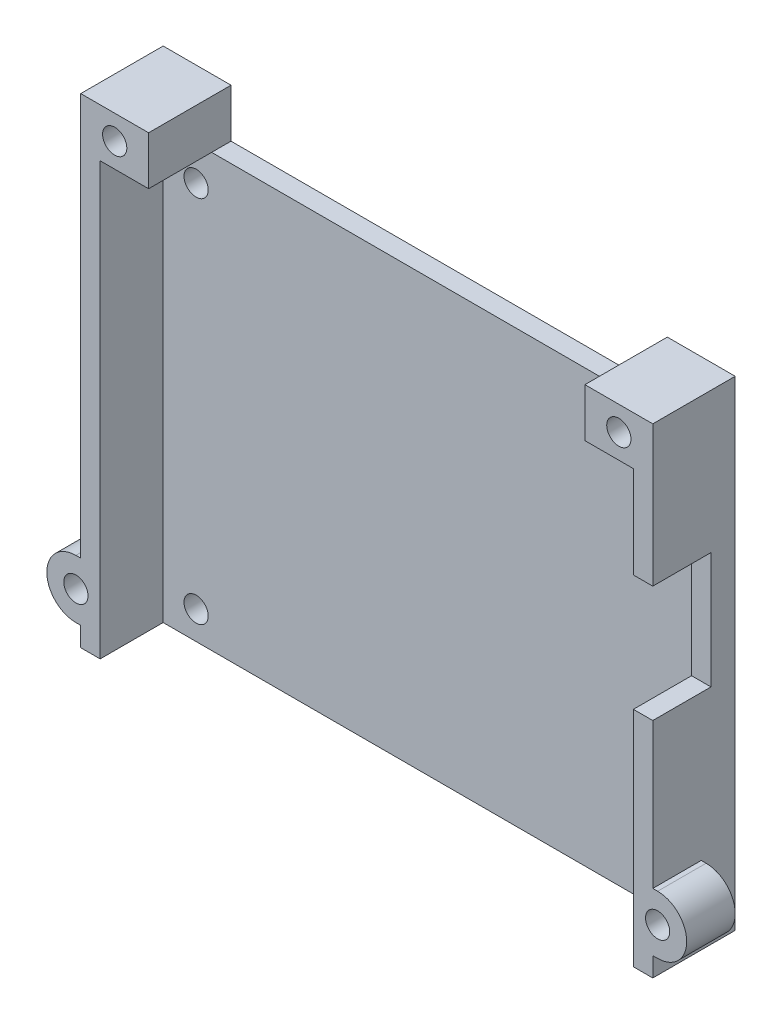
ISO-10303-21;
HEADER;
FILE_DESCRIPTION(('STEP AP214'),'2;1');
FILE_NAME('part.step','',(''),(''),'','','');
FILE_SCHEMA(('AUTOMOTIVE_DESIGN { 1 0 10303 214 1 1 1 1 }'));
ENDSEC;
DATA;
#1=APPLICATION_CONTEXT('core data for automotive mechanical design processes');
#2=APPLICATION_PROTOCOL_DEFINITION('international standard','automotive_design',2000,#1);
#3=PRODUCT_CONTEXT('',#1,'mechanical');
#4=PRODUCT('Part','Part','',(#3));
#5=PRODUCT_RELATED_PRODUCT_CATEGORY('part','',(#4));
#6=PRODUCT_DEFINITION_FORMATION('','',#4);
#7=PRODUCT_DEFINITION_CONTEXT('part definition',#1,'design');
#8=PRODUCT_DEFINITION('design','',#6,#7);
#9=PRODUCT_DEFINITION_SHAPE('','',#8);
#10=(LENGTH_UNIT() NAMED_UNIT(*) SI_UNIT(.MILLI.,.METRE.));
#11=(NAMED_UNIT(*) PLANE_ANGLE_UNIT() SI_UNIT($,.RADIAN.));
#12=(NAMED_UNIT(*) SI_UNIT($,.STERADIAN.) SOLID_ANGLE_UNIT());
#13=UNCERTAINTY_MEASURE_WITH_UNIT(LENGTH_MEASURE(1.E-05),#10,'distance_accuracy_value','');
#14=(GEOMETRIC_REPRESENTATION_CONTEXT(3) GLOBAL_UNCERTAINTY_ASSIGNED_CONTEXT((#13)) GLOBAL_UNIT_ASSIGNED_CONTEXT((#10,
#11,#12)) REPRESENTATION_CONTEXT('',''));
#15=CARTESIAN_POINT('',(0.,0.,0.));
#16=DIRECTION('',(0.,0.,1.));
#17=DIRECTION('',(1.,0.,0.));
#18=AXIS2_PLACEMENT_3D('',#15,#16,#17);
#19=CARTESIAN_POINT('',(59.5,5.,0.));
#20=DIRECTION('',(0.,0.,-1.));
#21=DIRECTION('',(-1.,0.,0.));
#22=AXIS2_PLACEMENT_3D('',#19,#20,#21);
#23=CYLINDRICAL_SURFACE('',#22,1.25000000000001);
#24=CARTESIAN_POINT('',(59.5,5.,0.));
#25=DIRECTION('',(0.,0.,-1.));
#26=DIRECTION('',(-1.,0.,0.));
#27=AXIS2_PLACEMENT_3D('',#24,#25,#26);
#28=CIRCLE('',#27,1.25000000000001);
#29=CARTESIAN_POINT('',(58.25,5.,0.));
#30=VERTEX_POINT('',#29);
#31=EDGE_CURVE('E424',#30,#30,#28,.T.);
#32=ORIENTED_EDGE('',*,*,#31,.F.);
#33=EDGE_LOOP('',(#32));
#34=FACE_BOUND('',#33,.T.);
#35=CARTESIAN_POINT('',(59.5,5.,-5.5));
#36=DIRECTION('',(0.,0.,-1.));
#37=DIRECTION('',(-1.,0.,0.));
#38=AXIS2_PLACEMENT_3D('',#35,#36,#37);
#39=CIRCLE('',#38,1.25000000000001);
#40=CARTESIAN_POINT('',(59.,3.85435607626104,-5.5));
#41=VERTEX_POINT('',#40);
#42=CARTESIAN_POINT('',(59.,6.14564392373897,-5.5));
#43=VERTEX_POINT('',#42);
#44=EDGE_CURVE('E251',#41,#43,#39,.T.);
#45=ORIENTED_EDGE('',*,*,#44,.T.);
#46=DIRECTION('',(0.,0.,-1.));
#47=VECTOR('',#46,1.);
#48=CARTESIAN_POINT('',(59.,6.14564392373897,-5.));
#49=LINE('',#48,#47);
#50=CARTESIAN_POINT('',(59.,6.14564392373897,-5.));
#51=VERTEX_POINT('',#50);
#52=EDGE_CURVE('E247',#51,#43,#49,.T.);
#53=ORIENTED_EDGE('',*,*,#52,.F.);
#54=CARTESIAN_POINT('',(59.5,5.,-5.));
#55=DIRECTION('',(0.,0.,-1.));
#56=DIRECTION('',(-1.,0.,0.));
#57=AXIS2_PLACEMENT_3D('',#54,#55,#56);
#58=CIRCLE('',#57,1.25000000000001);
#59=CARTESIAN_POINT('',(59.,3.85435607626104,-5.));
#60=VERTEX_POINT('',#59);
#61=EDGE_CURVE('E258',#51,#60,#58,.T.);
#62=ORIENTED_EDGE('',*,*,#61,.T.);
#63=DIRECTION('',(0.,0.,-1.));
#64=VECTOR('',#63,1.);
#65=CARTESIAN_POINT('',(59.,3.85435607626104,-5.));
#66=LINE('',#65,#64);
#67=EDGE_CURVE('E244',#60,#41,#66,.T.);
#68=ORIENTED_EDGE('',*,*,#67,.T.);
#69=EDGE_LOOP('',(#45,#53,#62,#68));
#70=FACE_BOUND('',#69,.T.);
#71=ADVANCED_FACE('F45',(#34,#70),#23,.F.);
#72=CARTESIAN_POINT('',(-0.5,5.,0.));
#73=DIRECTION('',(0.,0.,-1.));
#74=DIRECTION('',(-1.,0.,0.));
#75=AXIS2_PLACEMENT_3D('',#72,#73,#74);
#76=CYLINDRICAL_SURFACE('',#75,1.25);
#77=CARTESIAN_POINT('',(-0.5,5.,0.));
#78=DIRECTION('',(0.,0.,-1.));
#79=DIRECTION('',(-1.,0.,0.));
#80=AXIS2_PLACEMENT_3D('',#77,#78,#79);
#81=CIRCLE('',#80,1.25);
#82=CARTESIAN_POINT('',(-1.75,5.,0.));
#83=VERTEX_POINT('',#82);
#84=EDGE_CURVE('E405',#83,#83,#81,.T.);
#85=ORIENTED_EDGE('',*,*,#84,.F.);
#86=EDGE_LOOP('',(#85));
#87=FACE_BOUND('',#86,.T.);
#88=CARTESIAN_POINT('',(-0.5,5.,-5.5));
#89=DIRECTION('',(0.,0.,-1.));
#90=DIRECTION('',(-1.,0.,0.));
#91=AXIS2_PLACEMENT_3D('',#88,#89,#90);
#92=CIRCLE('',#91,1.25);
#93=CARTESIAN_POINT('',(0.,6.14564392373896,-5.5));
#94=VERTEX_POINT('',#93);
#95=CARTESIAN_POINT('',(0.,3.85435607626104,-5.5));
#96=VERTEX_POINT('',#95);
#97=EDGE_CURVE('E277',#94,#96,#92,.T.);
#98=ORIENTED_EDGE('',*,*,#97,.T.);
#99=DIRECTION('',(0.,0.,-1.));
#100=VECTOR('',#99,1.);
#101=CARTESIAN_POINT('',(0.,3.85435607626104,-5.));
#102=LINE('',#101,#100);
#103=CARTESIAN_POINT('',(0.,3.85435607626104,-5.));
#104=VERTEX_POINT('',#103);
#105=EDGE_CURVE('E296',#104,#96,#102,.T.);
#106=ORIENTED_EDGE('',*,*,#105,.F.);
#107=CARTESIAN_POINT('',(-0.5,5.,-5.));
#108=DIRECTION('',(0.,0.,-1.));
#109=DIRECTION('',(-1.,0.,0.));
#110=AXIS2_PLACEMENT_3D('',#107,#108,#109);
#111=CIRCLE('',#110,1.25);
#112=CARTESIAN_POINT('',(0.,6.14564392373896,-5.));
#113=VERTEX_POINT('',#112);
#114=EDGE_CURVE('E273',#104,#113,#111,.T.);
#115=ORIENTED_EDGE('',*,*,#114,.T.);
#116=DIRECTION('',(0.,0.,-1.));
#117=VECTOR('',#116,1.);
#118=CARTESIAN_POINT('',(0.,6.14564392373896,-5.));
#119=LINE('',#118,#117);
#120=EDGE_CURVE('E292',#113,#94,#119,.T.);
#121=ORIENTED_EDGE('',*,*,#120,.T.);
#122=EDGE_LOOP('',(#98,#106,#115,#121));
#123=FACE_BOUND('',#122,.T.);
#124=ADVANCED_FACE('F669',(#87,#123),#76,.F.);
#125=CARTESIAN_POINT('',(0.,44.5,-8.5));
#126=DIRECTION('',(0.,0.,1.));
#127=DIRECTION('',(1.,0.,0.));
#128=AXIS2_PLACEMENT_3D('',#125,#126,#127);
#129=PLANE('',#128);
#130=CARTESIAN_POINT('',(53.6,2.9,-8.5));
#131=DIRECTION('',(0.,0.,-1.));
#132=DIRECTION('',(-1.,0.,0.));
#133=AXIS2_PLACEMENT_3D('',#130,#131,#132);
#134=CIRCLE('',#133,1.25);
#135=CARTESIAN_POINT('',(52.35,2.9,-8.5));
#136=VERTEX_POINT('',#135);
#137=EDGE_CURVE('E260',#136,#136,#134,.T.);
#138=ORIENTED_EDGE('',*,*,#137,.F.);
#139=EDGE_LOOP('',(#138));
#140=FACE_BOUND('',#139,.T.);
#141=CARTESIAN_POINT('',(5.4,2.90000000000001,-8.5));
#142=DIRECTION('',(0.,0.,-1.));
#143=DIRECTION('',(-1.,0.,0.));
#144=AXIS2_PLACEMENT_3D('',#141,#142,#143);
#145=CIRCLE('',#144,1.25);
#146=CARTESIAN_POINT('',(4.15,2.90000000000001,-8.5));
#147=VERTEX_POINT('',#146);
#148=EDGE_CURVE('E265',#147,#147,#145,.T.);
#149=ORIENTED_EDGE('',*,*,#148,.F.);
#150=EDGE_LOOP('',(#149));
#151=FACE_BOUND('',#150,.T.);
#152=CARTESIAN_POINT('',(5.4,40.95,-8.5));
#153=DIRECTION('',(0.,0.,-1.));
#154=DIRECTION('',(-1.,0.,0.));
#155=AXIS2_PLACEMENT_3D('',#152,#153,#154);
#156=CIRCLE('',#155,1.25);
#157=CARTESIAN_POINT('',(4.15,40.95,-8.5));
#158=VERTEX_POINT('',#157);
#159=EDGE_CURVE('E300',#158,#158,#156,.T.);
#160=ORIENTED_EDGE('',*,*,#159,.F.);
#161=EDGE_LOOP('',(#160));
#162=FACE_BOUND('',#161,.T.);
#163=CARTESIAN_POINT('',(53.6,40.95,-8.5));
#164=DIRECTION('',(0.,0.,-1.));
#165=DIRECTION('',(-1.,0.,0.));
#166=AXIS2_PLACEMENT_3D('',#163,#164,#165);
#167=CIRCLE('',#166,1.25);
#168=CARTESIAN_POINT('',(52.35,40.95,-8.5));
#169=VERTEX_POINT('',#168);
#170=EDGE_CURVE('E304',#169,#169,#167,.T.);
#171=ORIENTED_EDGE('',*,*,#170,.F.);
#172=EDGE_LOOP('',(#171));
#173=FACE_BOUND('',#172,.T.);
#174=CARTESIAN_POINT('',(55.5,47.,-8.5));
#175=DIRECTION('',(0.,0.,-1.));
#176=DIRECTION('',(-1.,0.,0.));
#177=AXIS2_PLACEMENT_3D('',#174,#175,#176);
#178=CIRCLE('',#177,1.25);
#179=CARTESIAN_POINT('',(54.25,47.,-8.5));
#180=VERTEX_POINT('',#179);
#181=EDGE_CURVE('E333',#180,#180,#178,.T.);
#182=ORIENTED_EDGE('',*,*,#181,.F.);
#183=EDGE_LOOP('',(#182));
#184=FACE_BOUND('',#183,.T.);
#185=CARTESIAN_POINT('',(3.5,47.,-8.5));
#186=DIRECTION('',(0.,0.,-1.));
#187=DIRECTION('',(-1.,0.,0.));
#188=AXIS2_PLACEMENT_3D('',#185,#186,#187);
#189=CIRCLE('',#188,1.25);
#190=CARTESIAN_POINT('',(2.25,47.,-8.5));
#191=VERTEX_POINT('',#190);
#192=EDGE_CURVE('E337',#191,#191,#189,.T.);
#193=ORIENTED_EDGE('',*,*,#192,.F.);
#194=EDGE_LOOP('',(#193));
#195=FACE_BOUND('',#194,.T.);
#196=DIRECTION('',(0.,-1.,0.));
#197=VECTOR('',#196,1.);
#198=CARTESIAN_POINT('',(59.,44.5,-8.5));
#199=LINE('',#198,#197);
#200=CARTESIAN_POINT('',(59.,49.5,-8.5));
#201=VERTEX_POINT('',#200);
#202=CARTESIAN_POINT('',(59.,0.,-8.5));
#203=VERTEX_POINT('',#202);
#204=EDGE_CURVE('E550',#201,#203,#199,.T.);
#205=ORIENTED_EDGE('',*,*,#204,.T.);
#206=DIRECTION('',(-1.,0.,0.));
#207=VECTOR('',#206,1.);
#208=CARTESIAN_POINT('',(0.,0.,-8.5));
#209=LINE('',#208,#207);
#210=CARTESIAN_POINT('',(0.,0.,-8.5));
#211=VERTEX_POINT('',#210);
#212=EDGE_CURVE('E508',#203,#211,#209,.T.);
#213=ORIENTED_EDGE('',*,*,#212,.T.);
#214=DIRECTION('',(0.,-1.,0.));
#215=VECTOR('',#214,1.);
#216=CARTESIAN_POINT('',(0.,44.5,-8.5));
#217=LINE('',#216,#215);
#218=CARTESIAN_POINT('',(0.,49.5,-8.5));
#219=VERTEX_POINT('',#218);
#220=EDGE_CURVE('E520',#219,#211,#217,.T.);
#221=ORIENTED_EDGE('',*,*,#220,.F.);
#222=DIRECTION('',(-1.,0.,0.));
#223=VECTOR('',#222,1.);
#224=CARTESIAN_POINT('',(0.,49.5,-8.5));
#225=LINE('',#224,#223);
#226=CARTESIAN_POINT('',(7.,49.5,-8.5));
#227=VERTEX_POINT('',#226);
#228=EDGE_CURVE('E389',#227,#219,#225,.T.);
#229=ORIENTED_EDGE('',*,*,#228,.F.);
#230=DIRECTION('',(0.,-1.,0.));
#231=VECTOR('',#230,1.);
#232=CARTESIAN_POINT('',(7.,49.5,-8.5));
#233=LINE('',#232,#231);
#234=CARTESIAN_POINT('',(7.,44.5,-8.5));
#235=VERTEX_POINT('',#234);
#236=EDGE_CURVE('E393',#227,#235,#233,.T.);
#237=ORIENTED_EDGE('',*,*,#236,.T.);
#238=DIRECTION('',(-1.,0.,0.));
#239=VECTOR('',#238,1.);
#240=CARTESIAN_POINT('',(0.,44.5,-8.5));
#241=LINE('',#240,#239);
#242=CARTESIAN_POINT('',(52.,44.5,-8.5));
#243=VERTEX_POINT('',#242);
#244=EDGE_CURVE('E517',#243,#235,#241,.T.);
#245=ORIENTED_EDGE('',*,*,#244,.F.);
#246=DIRECTION('',(0.,-1.,0.));
#247=VECTOR('',#246,1.);
#248=CARTESIAN_POINT('',(52.,49.5,-8.5));
#249=LINE('',#248,#247);
#250=CARTESIAN_POINT('',(52.,49.5,-8.5));
#251=VERTEX_POINT('',#250);
#252=EDGE_CURVE('E332',#251,#243,#249,.T.);
#253=ORIENTED_EDGE('',*,*,#252,.F.);
#254=DIRECTION('',(-1.,0.,0.));
#255=VECTOR('',#254,1.);
#256=CARTESIAN_POINT('',(59.,49.5,-8.5));
#257=LINE('',#256,#255);
#258=EDGE_CURVE('E369',#201,#251,#257,.T.);
#259=ORIENTED_EDGE('',*,*,#258,.F.);
#260=EDGE_LOOP('',(#205,#213,#221,#229,#237,#245,#253,#259));
#261=FACE_BOUND('',#260,.T.);
#262=ADVANCED_FACE('F622',(#140,#151,#162,#173,#184,#195,#261),#129,.F.);
#263=CARTESIAN_POINT('',(0.,2.00000000000005,0.));
#264=DIRECTION('',(0.,1.,0.));
#265=DIRECTION('',(-1.,0.,0.));
#266=AXIS2_PLACEMENT_3D('',#263,#264,#265);
#267=PLANE('',#266);
#268=DIRECTION('',(1.,0.,0.));
#269=VECTOR('',#268,1.);
#270=CARTESIAN_POINT('',(0.,2.00000000000005,-5.));
#271=LINE('',#270,#269);
#272=CARTESIAN_POINT('',(59.,2.,-5.));
#273=VERTEX_POINT('',#272);
#274=CARTESIAN_POINT('',(59.5,2.,-5.));
#275=VERTEX_POINT('',#274);
#276=EDGE_CURVE('E270',#273,#275,#271,.T.);
#277=ORIENTED_EDGE('',*,*,#276,.T.);
#278=DIRECTION('',(0.,0.,-1.));
#279=VECTOR('',#278,1.);
#280=CARTESIAN_POINT('',(59.5,2.,0.));
#281=LINE('',#280,#279);
#282=CARTESIAN_POINT('',(59.5,2.,0.));
#283=VERTEX_POINT('',#282);
#284=EDGE_CURVE('E456',#283,#275,#281,.T.);
#285=ORIENTED_EDGE('',*,*,#284,.F.);
#286=DIRECTION('',(1.,0.,0.));
#287=VECTOR('',#286,1.);
#288=CARTESIAN_POINT('',(0.,2.00000000000005,0.));
#289=LINE('',#288,#287);
#290=CARTESIAN_POINT('',(59.,2.,0.));
#291=VERTEX_POINT('',#290);
#292=EDGE_CURVE('E447',#291,#283,#289,.T.);
#293=ORIENTED_EDGE('',*,*,#292,.F.);
#294=DIRECTION('',(0.,0.,-1.));
#295=VECTOR('',#294,1.);
#296=CARTESIAN_POINT('',(59.,2.,0.));
#297=LINE('',#296,#295);
#298=EDGE_CURVE('E451',#291,#273,#297,.T.);
#299=ORIENTED_EDGE('',*,*,#298,.T.);
#300=EDGE_LOOP('',(#277,#285,#293,#299));
#301=FACE_BOUND('',#300,.T.);
#302=ADVANCED_FACE('F701',(#301),#267,.F.);
#303=CARTESIAN_POINT('',(59.5,5.,0.));
#304=DIRECTION('',(0.,0.,-1.));
#305=DIRECTION('',(-1.,0.,0.));
#306=AXIS2_PLACEMENT_3D('',#303,#304,#305);
#307=CYLINDRICAL_SURFACE('',#306,3.);
#308=ORIENTED_EDGE('',*,*,#284,.T.);
#309=CARTESIAN_POINT('',(59.5,5.,-5.));
#310=DIRECTION('',(0.,0.,-1.));
#311=DIRECTION('',(-1.,0.,0.));
#312=AXIS2_PLACEMENT_3D('',#309,#310,#311);
#313=CIRCLE('',#312,3.);
#314=CARTESIAN_POINT('',(59.5,8.,-5.));
#315=VERTEX_POINT('',#314);
#316=EDGE_CURVE('E1161',#315,#275,#313,.T.);
#317=ORIENTED_EDGE('',*,*,#316,.F.);
#318=DIRECTION('',(0.,0.,-1.));
#319=VECTOR('',#318,1.);
#320=CARTESIAN_POINT('',(59.5,8.,0.));
#321=LINE('',#320,#319);
#322=CARTESIAN_POINT('',(59.5,8.,0.));
#323=VERTEX_POINT('',#322);
#324=EDGE_CURVE('E460',#323,#315,#321,.T.);
#325=ORIENTED_EDGE('',*,*,#324,.F.);
#326=CARTESIAN_POINT('',(59.5,5.,0.));
#327=DIRECTION('',(0.,0.,-1.));
#328=DIRECTION('',(-1.,0.,0.));
#329=AXIS2_PLACEMENT_3D('',#326,#327,#328);
#330=CIRCLE('',#329,3.);
#331=EDGE_CURVE('E443',#323,#283,#330,.T.);
#332=ORIENTED_EDGE('',*,*,#331,.T.);
#333=EDGE_LOOP('',(#308,#317,#325,#332));
#334=FACE_BOUND('',#333,.T.);
#335=ADVANCED_FACE('F981',(#334),#307,.T.);
#336=CARTESIAN_POINT('',(0.,8.0000000000002,0.));
#337=DIRECTION('',(0.,1.,0.));
#338=DIRECTION('',(-1.,0.,0.));
#339=AXIS2_PLACEMENT_3D('',#336,#337,#338);
#340=PLANE('',#339);
#341=ORIENTED_EDGE('',*,*,#324,.T.);
#342=DIRECTION('',(1.,0.,0.));
#343=VECTOR('',#342,1.);
#344=CARTESIAN_POINT('',(0.,8.0000000000002,-5.));
#345=LINE('',#344,#343);
#346=CARTESIAN_POINT('',(59.,8.,-5.));
#347=VERTEX_POINT('',#346);
#348=EDGE_CURVE('E1165',#347,#315,#345,.T.);
#349=ORIENTED_EDGE('',*,*,#348,.F.);
#350=DIRECTION('',(0.,0.,-1.));
#351=VECTOR('',#350,1.);
#352=CARTESIAN_POINT('',(59.,8.,0.));
#353=LINE('',#352,#351);
#354=CARTESIAN_POINT('',(59.,8.,0.));
#355=VERTEX_POINT('',#354);
#356=EDGE_CURVE('E450',#355,#347,#353,.T.);
#357=ORIENTED_EDGE('',*,*,#356,.F.);
#358=DIRECTION('',(1.,0.,0.));
#359=VECTOR('',#358,1.);
#360=CARTESIAN_POINT('',(0.,8.0000000000002,0.));
#361=LINE('',#360,#359);
#362=EDGE_CURVE('E439',#355,#323,#361,.T.);
#363=ORIENTED_EDGE('',*,*,#362,.T.);
#364=EDGE_LOOP('',(#341,#349,#357,#363));
#365=FACE_BOUND('',#364,.T.);
#366=ADVANCED_FACE('F680',(#365),#340,.T.);
#367=CARTESIAN_POINT('',(0.,8.,0.));
#368=DIRECTION('',(0.,-1.,0.));
#369=DIRECTION('',(0.,0.,-1.));
#370=AXIS2_PLACEMENT_3D('',#367,#368,#369);
#371=PLANE('',#370);
#372=DIRECTION('',(-1.,0.,0.));
#373=VECTOR('',#372,1.);
#374=CARTESIAN_POINT('',(0.,8.,-5.));
#375=LINE('',#374,#373);
#376=CARTESIAN_POINT('',(0.,8.,-5.));
#377=VERTEX_POINT('',#376);
#378=CARTESIAN_POINT('',(-0.5,8.,-5.));
#379=VERTEX_POINT('',#378);
#380=EDGE_CURVE('E288',#377,#379,#375,.T.);
#381=ORIENTED_EDGE('',*,*,#380,.T.);
#382=DIRECTION('',(0.,0.,-1.));
#383=VECTOR('',#382,1.);
#384=CARTESIAN_POINT('',(-0.5,8.,0.));
#385=LINE('',#384,#383);
#386=CARTESIAN_POINT('',(-0.5,8.,0.));
#387=VERTEX_POINT('',#386);
#388=EDGE_CURVE('E425',#387,#379,#385,.T.);
#389=ORIENTED_EDGE('',*,*,#388,.F.);
#390=DIRECTION('',(-1.,0.,0.));
#391=VECTOR('',#390,1.);
#392=CARTESIAN_POINT('',(0.,8.,0.));
#393=LINE('',#392,#391);
#394=CARTESIAN_POINT('',(0.,8.,0.));
#395=VERTEX_POINT('',#394);
#396=EDGE_CURVE('E416',#395,#387,#393,.T.);
#397=ORIENTED_EDGE('',*,*,#396,.F.);
#398=DIRECTION('',(0.,0.,-1.));
#399=VECTOR('',#398,1.);
#400=CARTESIAN_POINT('',(0.,8.,0.));
#401=LINE('',#400,#399);
#402=EDGE_CURVE('E420',#395,#377,#401,.T.);
#403=ORIENTED_EDGE('',*,*,#402,.T.);
#404=EDGE_LOOP('',(#381,#389,#397,#403));
#405=FACE_BOUND('',#404,.T.);
#406=ADVANCED_FACE('F593',(#405),#371,.F.);
#407=CARTESIAN_POINT('',(-0.5,5.,0.));
#408=DIRECTION('',(0.,0.,-1.));
#409=DIRECTION('',(-1.,0.,0.));
#410=AXIS2_PLACEMENT_3D('',#407,#408,#409);
#411=CYLINDRICAL_SURFACE('',#410,3.);
#412=CARTESIAN_POINT('',(-0.5,5.,-5.));
#413=DIRECTION('',(0.,0.,-1.));
#414=DIRECTION('',(-1.,0.,0.));
#415=AXIS2_PLACEMENT_3D('',#412,#413,#414);
#416=CIRCLE('',#415,3.);
#417=CARTESIAN_POINT('',(-0.5,2.,-5.));
#418=VERTEX_POINT('',#417);
#419=EDGE_CURVE('E284',#379,#418,#416,.F.);
#420=ORIENTED_EDGE('',*,*,#419,.T.);
#421=DIRECTION('',(0.,0.,-1.));
#422=VECTOR('',#421,1.);
#423=CARTESIAN_POINT('',(-0.5,2.,0.));
#424=LINE('',#423,#422);
#425=CARTESIAN_POINT('',(-0.5,2.,0.));
#426=VERTEX_POINT('',#425);
#427=EDGE_CURVE('E429',#426,#418,#424,.T.);
#428=ORIENTED_EDGE('',*,*,#427,.F.);
#429=CARTESIAN_POINT('',(-0.5,5.,0.));
#430=DIRECTION('',(0.,0.,-1.));
#431=DIRECTION('',(-1.,0.,0.));
#432=AXIS2_PLACEMENT_3D('',#429,#430,#431);
#433=CIRCLE('',#432,3.);
#434=EDGE_CURVE('E413',#387,#426,#433,.F.);
#435=ORIENTED_EDGE('',*,*,#434,.F.);
#436=ORIENTED_EDGE('',*,*,#388,.T.);
#437=EDGE_LOOP('',(#420,#428,#435,#436));
#438=FACE_BOUND('',#437,.T.);
#439=ADVANCED_FACE('F598',(#438),#411,.T.);
#440=CARTESIAN_POINT('',(0.,2.,0.));
#441=DIRECTION('',(0.,-1.,0.));
#442=DIRECTION('',(0.,0.,-1.));
#443=AXIS2_PLACEMENT_3D('',#440,#441,#442);
#444=PLANE('',#443);
#445=ORIENTED_EDGE('',*,*,#427,.T.);
#446=DIRECTION('',(-1.,0.,0.));
#447=VECTOR('',#446,1.);
#448=CARTESIAN_POINT('',(0.,2.,-5.));
#449=LINE('',#448,#447);
#450=CARTESIAN_POINT('',(0.,2.,-5.));
#451=VERTEX_POINT('',#450);
#452=EDGE_CURVE('E280',#451,#418,#449,.T.);
#453=ORIENTED_EDGE('',*,*,#452,.F.);
#454=DIRECTION('',(0.,0.,-1.));
#455=VECTOR('',#454,1.);
#456=CARTESIAN_POINT('',(0.,2.,0.));
#457=LINE('',#456,#455);
#458=CARTESIAN_POINT('',(0.,2.,0.));
#459=VERTEX_POINT('',#458);
#460=EDGE_CURVE('E419',#459,#451,#457,.T.);
#461=ORIENTED_EDGE('',*,*,#460,.F.);
#462=DIRECTION('',(-1.,0.,0.));
#463=VECTOR('',#462,1.);
#464=CARTESIAN_POINT('',(0.,2.,0.));
#465=LINE('',#464,#463);
#466=EDGE_CURVE('E409',#459,#426,#465,.T.);
#467=ORIENTED_EDGE('',*,*,#466,.T.);
#468=EDGE_LOOP('',(#445,#453,#461,#467));
#469=FACE_BOUND('',#468,.T.);
#470=ADVANCED_FACE('F601',(#469),#444,.T.);
#471=CARTESIAN_POINT('',(0.,44.5,0.));
#472=DIRECTION('',(0.,-1.,0.));
#473=DIRECTION('',(0.,0.,-1.));
#474=AXIS2_PLACEMENT_3D('',#471,#472,#473);
#475=PLANE('',#474);
#476=DIRECTION('',(0.,0.,1.));
#477=VECTOR('',#476,1.);
#478=CARTESIAN_POINT('',(52.,44.5,0.));
#479=LINE('',#478,#477);
#480=CARTESIAN_POINT('',(52.,44.5,-6.5));
#481=VERTEX_POINT('',#480);
#482=EDGE_CURVE('E358',#243,#481,#479,.T.);
#483=ORIENTED_EDGE('',*,*,#482,.F.);
#484=ORIENTED_EDGE('',*,*,#244,.T.);
#485=DIRECTION('',(0.,0.,-1.));
#486=VECTOR('',#485,1.);
#487=CARTESIAN_POINT('',(7.,44.5,0.));
#488=LINE('',#487,#486);
#489=CARTESIAN_POINT('',(7.,44.5,-6.5));
#490=VERTEX_POINT('',#489);
#491=EDGE_CURVE('E11',#490,#235,#488,.T.);
#492=ORIENTED_EDGE('',*,*,#491,.F.);
#493=DIRECTION('',(1.,0.,0.));
#494=VECTOR('',#493,1.);
#495=CARTESIAN_POINT('',(2.,44.5,-6.5));
#496=LINE('',#495,#494);
#497=EDGE_CURVE('E507',#490,#481,#496,.T.);
#498=ORIENTED_EDGE('',*,*,#497,.T.);
#499=EDGE_LOOP('',(#483,#484,#492,#498));
#500=FACE_BOUND('',#499,.T.);
#501=ADVANCED_FACE('F694',(#500),#475,.F.);
#502=CARTESIAN_POINT('',(57.,44.5,0.));
#503=DIRECTION('',(0.,0.,-1.));
#504=DIRECTION('',(-1.,0.,0.));
#505=AXIS2_PLACEMENT_3D('',#502,#503,#504);
#506=PLANE('',#505);
#507=CARTESIAN_POINT('',(55.5,47.,0.));
#508=DIRECTION('',(0.,0.,-1.));
#509=DIRECTION('',(-1.,0.,0.));
#510=AXIS2_PLACEMENT_3D('',#507,#508,#509);
#511=CIRCLE('',#510,1.25);
#512=CARTESIAN_POINT('',(54.25,47.,0.));
#513=VERTEX_POINT('',#512);
#514=EDGE_CURVE('E328',#513,#513,#511,.T.);
#515=ORIENTED_EDGE('',*,*,#514,.T.);
#516=EDGE_LOOP('',(#515));
#517=FACE_BOUND('',#516,.T.);
#518=DIRECTION('',(0.,-1.,0.));
#519=VECTOR('',#518,1.);
#520=CARTESIAN_POINT('',(57.,44.5,0.));
#521=LINE('',#520,#519);
#522=CARTESIAN_POINT('',(57.,44.5,0.));
#523=VERTEX_POINT('',#522);
#524=CARTESIAN_POINT('',(57.,35.,0.));
#525=VERTEX_POINT('',#524);
#526=EDGE_CURVE('E560',#523,#525,#521,.T.);
#527=ORIENTED_EDGE('',*,*,#526,.T.);
#528=DIRECTION('',(1.,0.,0.));
#529=VECTOR('',#528,1.);
#530=CARTESIAN_POINT('',(49.,35.,0.));
#531=LINE('',#530,#529);
#532=CARTESIAN_POINT('',(59.,35.,0.));
#533=VERTEX_POINT('',#532);
#534=EDGE_CURVE('E478',#525,#533,#531,.T.);
#535=ORIENTED_EDGE('',*,*,#534,.T.);
#536=DIRECTION('',(0.,-1.,0.));
#537=VECTOR('',#536,1.);
#538=CARTESIAN_POINT('',(59.,44.5,0.));
#539=LINE('',#538,#537);
#540=CARTESIAN_POINT('',(59.,49.5,0.));
#541=VERTEX_POINT('',#540);
#542=EDGE_CURVE('E554',#541,#533,#539,.T.);
#543=ORIENTED_EDGE('',*,*,#542,.F.);
#544=DIRECTION('',(1.,0.,0.));
#545=VECTOR('',#544,1.);
#546=CARTESIAN_POINT('',(59.,49.5,0.));
#547=LINE('',#546,#545);
#548=CARTESIAN_POINT('',(52.,49.5,0.));
#549=VERTEX_POINT('',#548);
#550=EDGE_CURVE('E351',#549,#541,#547,.T.);
#551=ORIENTED_EDGE('',*,*,#550,.F.);
#552=DIRECTION('',(0.,-1.,0.));
#553=VECTOR('',#552,1.);
#554=CARTESIAN_POINT('',(52.,49.5,0.));
#555=LINE('',#554,#553);
#556=CARTESIAN_POINT('',(52.,44.5,0.));
#557=VERTEX_POINT('',#556);
#558=EDGE_CURVE('E347',#549,#557,#555,.T.);
#559=ORIENTED_EDGE('',*,*,#558,.T.);
#560=DIRECTION('',(1.,0.,0.));
#561=VECTOR('',#560,1.);
#562=CARTESIAN_POINT('',(59.,44.5,0.));
#563=LINE('',#562,#561);
#564=EDGE_CURVE('E352',#557,#523,#563,.T.);
#565=ORIENTED_EDGE('',*,*,#564,.T.);
#566=EDGE_LOOP('',(#527,#535,#543,#551,#559,#565));
#567=FACE_BOUND('',#566,.T.);
#568=ADVANCED_FACE('F656',(#517,#567),#506,.F.);
#569=CARTESIAN_POINT('',(0.,44.5,0.));
#570=DIRECTION('',(1.,0.,0.));
#571=DIRECTION('',(0.,0.,-1.));
#572=AXIS2_PLACEMENT_3D('',#569,#570,#571);
#573=PLANE('',#572);
#574=DIRECTION('',(0.,-1.,0.));
#575=VECTOR('',#574,1.);
#576=CARTESIAN_POINT('',(0.,44.5,0.));
#577=LINE('',#576,#575);
#578=CARTESIAN_POINT('',(0.,0.,0.));
#579=VERTEX_POINT('',#578);
#580=EDGE_CURVE('E574',#459,#579,#577,.T.);
#581=ORIENTED_EDGE('',*,*,#580,.F.);
#582=ORIENTED_EDGE('',*,*,#460,.T.);
#583=DIRECTION('',(0.,1.,0.));
#584=VECTOR('',#583,1.);
#585=CARTESIAN_POINT('',(0.,0.,-5.));
#586=LINE('',#585,#584);
#587=EDGE_CURVE('E71',#451,#104,#586,.T.);
#588=ORIENTED_EDGE('',*,*,#587,.T.);
#589=ORIENTED_EDGE('',*,*,#105,.T.);
#590=DIRECTION('',(0.,1.,0.));
#591=VECTOR('',#590,1.);
#592=CARTESIAN_POINT('',(0.,0.,-5.5));
#593=LINE('',#592,#591);
#594=EDGE_CURVE('E256',#96,#94,#593,.T.);
#595=ORIENTED_EDGE('',*,*,#594,.T.);
#596=ORIENTED_EDGE('',*,*,#120,.F.);
#597=EDGE_CURVE('E281',#113,#377,#586,.T.);
#598=ORIENTED_EDGE('',*,*,#597,.T.);
#599=ORIENTED_EDGE('',*,*,#402,.F.);
#600=CARTESIAN_POINT('',(0.,49.5,0.));
#601=VERTEX_POINT('',#600);
#602=EDGE_CURVE('E49',#601,#395,#577,.T.);
#603=ORIENTED_EDGE('',*,*,#602,.F.);
#604=DIRECTION('',(0.,0.,1.));
#605=VECTOR('',#604,1.);
#606=CARTESIAN_POINT('',(0.,49.5,0.));
#607=LINE('',#606,#605);
#608=EDGE_CURVE('E379',#219,#601,#607,.T.);
#609=ORIENTED_EDGE('',*,*,#608,.F.);
#610=ORIENTED_EDGE('',*,*,#220,.T.);
#611=DIRECTION('',(0.,0.,1.));
#612=VECTOR('',#611,1.);
#613=CARTESIAN_POINT('',(0.,0.,0.));
#614=LINE('',#613,#612);
#615=EDGE_CURVE('E502',#211,#579,#614,.T.);
#616=ORIENTED_EDGE('',*,*,#615,.T.);
#617=EDGE_LOOP('',(#581,#582,#588,#589,#595,#596,#598,#599,#603,#609,#610,#616));
#618=FACE_BOUND('',#617,.T.);
#619=ADVANCED_FACE('F47',(#618),#573,.F.);
#620=CARTESIAN_POINT('',(0.,44.5,0.));
#621=DIRECTION('',(0.,0.,-1.));
#622=DIRECTION('',(-1.,0.,0.));
#623=AXIS2_PLACEMENT_3D('',#620,#621,#622);
#624=PLANE('',#623);
#625=CARTESIAN_POINT('',(3.5,47.,0.));
#626=DIRECTION('',(0.,0.,-1.));
#627=DIRECTION('',(-1.,0.,0.));
#628=AXIS2_PLACEMENT_3D('',#625,#626,#627);
#629=CIRCLE('',#628,1.25);
#630=CARTESIAN_POINT('',(2.25,47.,0.));
#631=VERTEX_POINT('',#630);
#632=EDGE_CURVE('E327',#631,#631,#629,.T.);
#633=ORIENTED_EDGE('',*,*,#632,.T.);
#634=EDGE_LOOP('',(#633));
#635=FACE_BOUND('',#634,.T.);
#636=ORIENTED_EDGE('',*,*,#602,.T.);
#637=ORIENTED_EDGE('',*,*,#396,.T.);
#638=ORIENTED_EDGE('',*,*,#434,.T.);
#639=ORIENTED_EDGE('',*,*,#466,.F.);
#640=ORIENTED_EDGE('',*,*,#580,.T.);
#641=DIRECTION('',(1.,0.,0.));
#642=VECTOR('',#641,1.);
#643=CARTESIAN_POINT('',(0.,0.,0.));
#644=LINE('',#643,#642);
#645=CARTESIAN_POINT('',(2.,0.,0.));
#646=VERTEX_POINT('',#645);
#647=EDGE_CURVE('E524',#579,#646,#644,.T.);
#648=ORIENTED_EDGE('',*,*,#647,.T.);
#649=DIRECTION('',(0.,-1.,0.));
#650=VECTOR('',#649,1.);
#651=CARTESIAN_POINT('',(2.,44.5,0.));
#652=LINE('',#651,#650);
#653=CARTESIAN_POINT('',(2.,44.5,0.));
#654=VERTEX_POINT('',#653);
#655=EDGE_CURVE('E571',#654,#646,#652,.T.);
#656=ORIENTED_EDGE('',*,*,#655,.F.);
#657=DIRECTION('',(1.,0.,0.));
#658=VECTOR('',#657,1.);
#659=CARTESIAN_POINT('',(0.,44.5,0.));
#660=LINE('',#659,#658);
#661=CARTESIAN_POINT('',(7.,44.5,0.));
#662=VERTEX_POINT('',#661);
#663=EDGE_CURVE('E378',#654,#662,#660,.T.);
#664=ORIENTED_EDGE('',*,*,#663,.T.);
#665=DIRECTION('',(0.,-1.,0.));
#666=VECTOR('',#665,1.);
#667=CARTESIAN_POINT('',(7.,49.5,0.));
#668=LINE('',#667,#666);
#669=CARTESIAN_POINT('',(7.,49.5,0.));
#670=VERTEX_POINT('',#669);
#671=EDGE_CURVE('E401',#670,#662,#668,.T.);
#672=ORIENTED_EDGE('',*,*,#671,.F.);
#673=DIRECTION('',(1.,0.,0.));
#674=VECTOR('',#673,1.);
#675=CARTESIAN_POINT('',(0.,49.5,0.));
#676=LINE('',#675,#674);
#677=EDGE_CURVE('E383',#601,#670,#676,.T.);
#678=ORIENTED_EDGE('',*,*,#677,.F.);
#679=EDGE_LOOP('',(#636,#637,#638,#639,#640,#648,#656,#664,#672,#678));
#680=FACE_BOUND('',#679,.T.);
#681=ORIENTED_EDGE('',*,*,#84,.T.);
#682=EDGE_LOOP('',(#681));
#683=FACE_BOUND('',#682,.T.);
#684=ADVANCED_FACE('F586',(#635,#680,#683),#624,.F.);
#685=CARTESIAN_POINT('',(2.,44.5,0.));
#686=DIRECTION('',(-1.,0.,0.));
#687=DIRECTION('',(0.,0.,1.));
#688=AXIS2_PLACEMENT_3D('',#685,#686,#687);
#689=PLANE('',#688);
#690=DIRECTION('',(0.,0.,-1.));
#691=VECTOR('',#690,1.);
#692=CARTESIAN_POINT('',(2.,0.,0.));
#693=LINE('',#692,#691);
#694=CARTESIAN_POINT('',(2.,0.,-6.5));
#695=VERTEX_POINT('',#694);
#696=EDGE_CURVE('E527',#646,#695,#693,.T.);
#697=ORIENTED_EDGE('',*,*,#696,.T.);
#698=DIRECTION('',(0.,-1.,0.));
#699=VECTOR('',#698,1.);
#700=CARTESIAN_POINT('',(2.,44.5,-6.5));
#701=LINE('',#700,#699);
#702=CARTESIAN_POINT('',(2.,44.5,-6.5));
#703=VERTEX_POINT('',#702);
#704=EDGE_CURVE('E568',#703,#695,#701,.T.);
#705=ORIENTED_EDGE('',*,*,#704,.F.);
#706=DIRECTION('',(0.,0.,-1.));
#707=VECTOR('',#706,1.);
#708=CARTESIAN_POINT('',(2.,44.5,0.));
#709=LINE('',#708,#707);
#710=EDGE_CURVE('E503',#654,#703,#709,.T.);
#711=ORIENTED_EDGE('',*,*,#710,.F.);
#712=ORIENTED_EDGE('',*,*,#655,.T.);
#713=EDGE_LOOP('',(#697,#705,#711,#712));
#714=FACE_BOUND('',#713,.T.);
#715=ADVANCED_FACE('F609',(#714),#689,.F.);
#716=CARTESIAN_POINT('',(2.,44.5,-6.5));
#717=DIRECTION('',(0.,0.,-1.));
#718=DIRECTION('',(-1.,0.,0.));
#719=AXIS2_PLACEMENT_3D('',#716,#717,#718);
#720=PLANE('',#719);
#721=CARTESIAN_POINT('',(53.6,2.9,-6.5));
#722=DIRECTION('',(0.,0.,-1.));
#723=DIRECTION('',(-1.,0.,0.));
#724=AXIS2_PLACEMENT_3D('',#721,#722,#723);
#725=CIRCLE('',#724,1.25);
#726=CARTESIAN_POINT('',(52.35,2.9,-6.5));
#727=VERTEX_POINT('',#726);
#728=EDGE_CURVE('E323',#727,#727,#725,.T.);
#729=ORIENTED_EDGE('',*,*,#728,.T.);
#730=EDGE_LOOP('',(#729));
#731=FACE_BOUND('',#730,.T.);
#732=CARTESIAN_POINT('',(5.4,2.90000000000001,-6.5));
#733=DIRECTION('',(0.,0.,-1.));
#734=DIRECTION('',(-1.,0.,0.));
#735=AXIS2_PLACEMENT_3D('',#732,#733,#734);
#736=CIRCLE('',#735,1.25);
#737=CARTESIAN_POINT('',(4.15,2.90000000000001,-6.5));
#738=VERTEX_POINT('',#737);
#739=EDGE_CURVE('E319',#738,#738,#736,.T.);
#740=ORIENTED_EDGE('',*,*,#739,.T.);
#741=EDGE_LOOP('',(#740));
#742=FACE_BOUND('',#741,.T.);
#743=CARTESIAN_POINT('',(5.4,40.95,-6.5));
#744=DIRECTION('',(0.,0.,-1.));
#745=DIRECTION('',(-1.,0.,0.));
#746=AXIS2_PLACEMENT_3D('',#743,#744,#745);
#747=CIRCLE('',#746,1.25);
#748=CARTESIAN_POINT('',(4.15,40.95,-6.5));
#749=VERTEX_POINT('',#748);
#750=EDGE_CURVE('E315',#749,#749,#747,.T.);
#751=ORIENTED_EDGE('',*,*,#750,.T.);
#752=EDGE_LOOP('',(#751));
#753=FACE_BOUND('',#752,.T.);
#754=CARTESIAN_POINT('',(53.6,40.95,-6.5));
#755=DIRECTION('',(0.,0.,-1.));
#756=DIRECTION('',(-1.,0.,0.));
#757=AXIS2_PLACEMENT_3D('',#754,#755,#756);
#758=CIRCLE('',#757,1.25);
#759=CARTESIAN_POINT('',(52.35,40.95,-6.5));
#760=VERTEX_POINT('',#759);
#761=EDGE_CURVE('E311',#760,#760,#758,.T.);
#762=ORIENTED_EDGE('',*,*,#761,.T.);
#763=EDGE_LOOP('',(#762));
#764=FACE_BOUND('',#763,.T.);
#765=DIRECTION('',(1.,0.,0.));
#766=VECTOR('',#765,1.);
#767=CARTESIAN_POINT('',(2.,0.,-6.5));
#768=LINE('',#767,#766);
#769=CARTESIAN_POINT('',(57.,0.,-6.5));
#770=VERTEX_POINT('',#769);
#771=EDGE_CURVE('E530',#695,#770,#768,.T.);
#772=ORIENTED_EDGE('',*,*,#771,.T.);
#773=DIRECTION('',(0.,-1.,0.));
#774=VECTOR('',#773,1.);
#775=CARTESIAN_POINT('',(57.,44.5,-6.5));
#776=LINE('',#775,#774);
#777=CARTESIAN_POINT('',(57.,44.5,-6.5));
#778=VERTEX_POINT('',#777);
#779=EDGE_CURVE('E564',#778,#770,#776,.T.);
#780=ORIENTED_EDGE('',*,*,#779,.F.);
#781=DIRECTION('',(1.,0.,0.));
#782=VECTOR('',#781,1.);
#783=CARTESIAN_POINT('',(2.,44.5,-6.5));
#784=LINE('',#783,#782);
#785=EDGE_CURVE('E362',#481,#778,#784,.T.);
#786=ORIENTED_EDGE('',*,*,#785,.F.);
#787=ORIENTED_EDGE('',*,*,#497,.F.);
#788=EDGE_CURVE('E509',#703,#490,#496,.T.);
#789=ORIENTED_EDGE('',*,*,#788,.F.);
#790=ORIENTED_EDGE('',*,*,#704,.T.);
#791=EDGE_LOOP('',(#772,#780,#786,#787,#789,#790));
#792=FACE_BOUND('',#791,.T.);
#793=ADVANCED_FACE('F640',(#731,#742,#753,#764,#792),#720,.F.);
#794=CARTESIAN_POINT('',(57.,44.5,-6.5));
#795=DIRECTION('',(1.,0.,0.));
#796=DIRECTION('',(0.,0.,-1.));
#797=AXIS2_PLACEMENT_3D('',#794,#795,#796);
#798=PLANE('',#797);
#799=DIRECTION('',(0.,1.,0.));
#800=VECTOR('',#799,1.);
#801=CARTESIAN_POINT('',(57.,44.5,-6.));
#802=LINE('',#801,#800);
#803=CARTESIAN_POINT('',(57.,23.,-6.));
#804=VERTEX_POINT('',#803);
#805=CARTESIAN_POINT('',(57.,35.,-6.));
#806=VERTEX_POINT('',#805);
#807=EDGE_CURVE('E494',#804,#806,#802,.T.);
#808=ORIENTED_EDGE('',*,*,#807,.T.);
#809=DIRECTION('',(0.,0.,1.));
#810=VECTOR('',#809,1.);
#811=CARTESIAN_POINT('',(57.,35.,-6.5));
#812=LINE('',#811,#810);
#813=EDGE_CURVE('E498',#806,#525,#812,.T.);
#814=ORIENTED_EDGE('',*,*,#813,.T.);
#815=ORIENTED_EDGE('',*,*,#526,.F.);
#816=DIRECTION('',(0.,0.,1.));
#817=VECTOR('',#816,1.);
#818=CARTESIAN_POINT('',(57.,44.5,-6.5));
#819=LINE('',#818,#817);
#820=EDGE_CURVE('E513',#778,#523,#819,.T.);
#821=ORIENTED_EDGE('',*,*,#820,.F.);
#822=ORIENTED_EDGE('',*,*,#779,.T.);
#823=DIRECTION('',(0.,0.,1.));
#824=VECTOR('',#823,1.);
#825=CARTESIAN_POINT('',(57.,0.,-6.5));
#826=LINE('',#825,#824);
#827=CARTESIAN_POINT('',(57.,0.,0.));
#828=VERTEX_POINT('',#827);
#829=EDGE_CURVE('E533',#770,#828,#826,.T.);
#830=ORIENTED_EDGE('',*,*,#829,.T.);
#831=CARTESIAN_POINT('',(57.,23.,0.));
#832=VERTEX_POINT('',#831);
#833=EDGE_CURVE('E558',#832,#828,#521,.T.);
#834=ORIENTED_EDGE('',*,*,#833,.F.);
#835=DIRECTION('',(0.,0.,-1.));
#836=VECTOR('',#835,1.);
#837=CARTESIAN_POINT('',(57.,23.,-6.5));
#838=LINE('',#837,#836);
#839=EDGE_CURVE('E482',#832,#804,#838,.T.);
#840=ORIENTED_EDGE('',*,*,#839,.T.);
#841=EDGE_LOOP('',(#808,#814,#815,#821,#822,#830,#834,#840));
#842=FACE_BOUND('',#841,.T.);
#843=ADVANCED_FACE('F637',(#842),#798,.F.);
#844=ORIENTED_EDGE('',*,*,#31,.T.);
#845=EDGE_LOOP('',(#844));
#846=FACE_BOUND('',#845,.T.);
#847=CARTESIAN_POINT('',(59.,23.,0.));
#848=VERTEX_POINT('',#847);
#849=EDGE_CURVE('E559',#848,#355,#539,.T.);
#850=ORIENTED_EDGE('',*,*,#849,.F.);
#851=DIRECTION('',(1.,0.,0.));
#852=VECTOR('',#851,1.);
#853=CARTESIAN_POINT('',(49.,23.,0.));
#854=LINE('',#853,#852);
#855=EDGE_CURVE('E477',#832,#848,#854,.T.);
#856=ORIENTED_EDGE('',*,*,#855,.F.);
#857=ORIENTED_EDGE('',*,*,#833,.T.);
#858=DIRECTION('',(1.,0.,0.));
#859=VECTOR('',#858,1.);
#860=CARTESIAN_POINT('',(57.,0.,0.));
#861=LINE('',#860,#859);
#862=CARTESIAN_POINT('',(59.,0.,0.));
#863=VERTEX_POINT('',#862);
#864=EDGE_CURVE('E537',#828,#863,#861,.T.);
#865=ORIENTED_EDGE('',*,*,#864,.T.);
#866=EDGE_CURVE('E553',#291,#863,#539,.T.);
#867=ORIENTED_EDGE('',*,*,#866,.F.);
#868=ORIENTED_EDGE('',*,*,#292,.T.);
#869=ORIENTED_EDGE('',*,*,#331,.F.);
#870=ORIENTED_EDGE('',*,*,#362,.F.);
#871=EDGE_LOOP('',(#850,#856,#857,#865,#867,#868,#869,#870));
#872=FACE_BOUND('',#871,.T.);
#873=ADVANCED_FACE('F632',(#846,#872),#506,.F.);
#874=CARTESIAN_POINT('',(59.,44.5,0.));
#875=DIRECTION('',(-1.,0.,0.));
#876=DIRECTION('',(0.,0.,1.));
#877=AXIS2_PLACEMENT_3D('',#874,#875,#876);
#878=PLANE('',#877);
#879=ORIENTED_EDGE('',*,*,#849,.T.);
#880=ORIENTED_EDGE('',*,*,#356,.T.);
#881=DIRECTION('',(0.,-1.,0.));
#882=VECTOR('',#881,1.);
#883=CARTESIAN_POINT('',(59.,0.,-5.));
#884=LINE('',#883,#882);
#885=EDGE_CURVE('E63',#347,#51,#884,.T.);
#886=ORIENTED_EDGE('',*,*,#885,.T.);
#887=ORIENTED_EDGE('',*,*,#52,.T.);
#888=DIRECTION('',(0.,-1.,0.));
#889=VECTOR('',#888,1.);
#890=CARTESIAN_POINT('',(59.,0.,-5.5));
#891=LINE('',#890,#889);
#892=EDGE_CURVE('E239',#43,#41,#891,.T.);
#893=ORIENTED_EDGE('',*,*,#892,.T.);
#894=ORIENTED_EDGE('',*,*,#67,.F.);
#895=EDGE_CURVE('E267',#60,#273,#884,.T.);
#896=ORIENTED_EDGE('',*,*,#895,.T.);
#897=ORIENTED_EDGE('',*,*,#298,.F.);
#898=ORIENTED_EDGE('',*,*,#866,.T.);
#899=DIRECTION('',(0.,0.,-1.));
#900=VECTOR('',#899,1.);
#901=CARTESIAN_POINT('',(59.,0.,0.));
#902=LINE('',#901,#900);
#903=EDGE_CURVE('E541',#863,#203,#902,.T.);
#904=ORIENTED_EDGE('',*,*,#903,.T.);
#905=ORIENTED_EDGE('',*,*,#204,.F.);
#906=DIRECTION('',(0.,0.,-1.));
#907=VECTOR('',#906,1.);
#908=CARTESIAN_POINT('',(59.,49.5,0.));
#909=LINE('',#908,#907);
#910=EDGE_CURVE('E357',#541,#201,#909,.T.);
#911=ORIENTED_EDGE('',*,*,#910,.F.);
#912=ORIENTED_EDGE('',*,*,#542,.T.);
#913=DIRECTION('',(0.,0.,1.));
#914=VECTOR('',#913,1.);
#915=CARTESIAN_POINT('',(59.,35.,-6.));
#916=LINE('',#915,#914);
#917=CARTESIAN_POINT('',(59.,35.,-6.));
#918=VERTEX_POINT('',#917);
#919=EDGE_CURVE('E474',#918,#533,#916,.T.);
#920=ORIENTED_EDGE('',*,*,#919,.F.);
#921=DIRECTION('',(0.,1.,0.));
#922=VECTOR('',#921,1.);
#923=CARTESIAN_POINT('',(59.,23.,-6.));
#924=LINE('',#923,#922);
#925=CARTESIAN_POINT('',(59.,23.,-6.));
#926=VERTEX_POINT('',#925);
#927=EDGE_CURVE('E470',#926,#918,#924,.T.);
#928=ORIENTED_EDGE('',*,*,#927,.F.);
#929=DIRECTION('',(0.,0.,-1.));
#930=VECTOR('',#929,1.);
#931=CARTESIAN_POINT('',(59.,23.,0.));
#932=LINE('',#931,#930);
#933=EDGE_CURVE('E455',#848,#926,#932,.T.);
#934=ORIENTED_EDGE('',*,*,#933,.F.);
#935=EDGE_LOOP('',(#879,#880,#886,#887,#893,#894,#896,#897,#898,#904,#905,#911,#912,#920,#928,#934));
#936=FACE_BOUND('',#935,.T.);
#937=ADVANCED_FACE('F242',(#936),#878,.F.);
#938=CARTESIAN_POINT('',(0.,0.,0.));
#939=DIRECTION('',(0.,-1.,0.));
#940=DIRECTION('',(0.,0.,-1.));
#941=AXIS2_PLACEMENT_3D('',#938,#939,#940);
#942=PLANE('',#941);
#943=ORIENTED_EDGE('',*,*,#615,.F.);
#944=ORIENTED_EDGE('',*,*,#212,.F.);
#945=ORIENTED_EDGE('',*,*,#903,.F.);
#946=ORIENTED_EDGE('',*,*,#864,.F.);
#947=ORIENTED_EDGE('',*,*,#829,.F.);
#948=ORIENTED_EDGE('',*,*,#771,.F.);
#949=ORIENTED_EDGE('',*,*,#696,.F.);
#950=ORIENTED_EDGE('',*,*,#647,.F.);
#951=EDGE_LOOP('',(#943,#944,#945,#946,#947,#948,#949,#950));
#952=FACE_BOUND('',#951,.T.);
#953=ADVANCED_FACE('F605',(#952),#942,.T.);
#954=CARTESIAN_POINT('',(49.,35.,-6.));
#955=DIRECTION('',(0.,1.,0.));
#956=DIRECTION('',(0.,0.,1.));
#957=AXIS2_PLACEMENT_3D('',#954,#955,#956);
#958=PLANE('',#957);
#959=DIRECTION('',(1.,0.,0.));
#960=VECTOR('',#959,1.);
#961=CARTESIAN_POINT('',(49.,35.,-6.));
#962=LINE('',#961,#960);
#963=EDGE_CURVE('E483',#806,#918,#962,.T.);
#964=ORIENTED_EDGE('',*,*,#963,.T.);
#965=ORIENTED_EDGE('',*,*,#919,.T.);
#966=ORIENTED_EDGE('',*,*,#534,.F.);
#967=ORIENTED_EDGE('',*,*,#813,.F.);
#968=EDGE_LOOP('',(#964,#965,#966,#967));
#969=FACE_BOUND('',#968,.T.);
#970=ADVANCED_FACE('F682',(#969),#958,.F.);
#971=CARTESIAN_POINT('',(49.,23.,-6.));
#972=DIRECTION('',(0.,0.,-1.));
#973=DIRECTION('',(-1.,0.,0.));
#974=AXIS2_PLACEMENT_3D('',#971,#972,#973);
#975=PLANE('',#974);
#976=DIRECTION('',(1.,0.,0.));
#977=VECTOR('',#976,1.);
#978=CARTESIAN_POINT('',(49.,23.,-6.));
#979=LINE('',#978,#977);
#980=EDGE_CURVE('E486',#804,#926,#979,.T.);
#981=ORIENTED_EDGE('',*,*,#980,.T.);
#982=ORIENTED_EDGE('',*,*,#927,.T.);
#983=ORIENTED_EDGE('',*,*,#963,.F.);
#984=ORIENTED_EDGE('',*,*,#807,.F.);
#985=EDGE_LOOP('',(#981,#982,#983,#984));
#986=FACE_BOUND('',#985,.T.);
#987=ADVANCED_FACE('F685',(#986),#975,.F.);
#988=CARTESIAN_POINT('',(49.,23.,0.));
#989=DIRECTION('',(0.,-1.,0.));
#990=DIRECTION('',(0.,0.,-1.));
#991=AXIS2_PLACEMENT_3D('',#988,#989,#990);
#992=PLANE('',#991);
#993=ORIENTED_EDGE('',*,*,#855,.T.);
#994=ORIENTED_EDGE('',*,*,#933,.T.);
#995=ORIENTED_EDGE('',*,*,#980,.F.);
#996=ORIENTED_EDGE('',*,*,#839,.F.);
#997=EDGE_LOOP('',(#993,#994,#995,#996));
#998=FACE_BOUND('',#997,.T.);
#999=ADVANCED_FACE('F689',(#998),#992,.F.);
#1000=CARTESIAN_POINT('',(7.,49.5,0.));
#1001=DIRECTION('',(-1.,0.,0.));
#1002=DIRECTION('',(0.,0.,1.));
#1003=AXIS2_PLACEMENT_3D('',#1000,#1001,#1002);
#1004=PLANE('',#1003);
#1005=EDGE_CURVE('E56',#662,#490,#488,.T.);
#1006=ORIENTED_EDGE('',*,*,#1005,.T.);
#1007=ORIENTED_EDGE('',*,*,#491,.T.);
#1008=ORIENTED_EDGE('',*,*,#236,.F.);
#1009=DIRECTION('',(0.,0.,-1.));
#1010=VECTOR('',#1009,1.);
#1011=CARTESIAN_POINT('',(7.,49.5,0.));
#1012=LINE('',#1011,#1010);
#1013=EDGE_CURVE('E386',#670,#227,#1012,.T.);
#1014=ORIENTED_EDGE('',*,*,#1013,.F.);
#1015=ORIENTED_EDGE('',*,*,#671,.T.);
#1016=EDGE_LOOP('',(#1006,#1007,#1008,#1014,#1015));
#1017=FACE_BOUND('',#1016,.T.);
#1018=ADVANCED_FACE('F615',(#1017),#1004,.F.);
#1019=CARTESIAN_POINT('',(0.,49.5,0.));
#1020=DIRECTION('',(0.,-1.,0.));
#1021=DIRECTION('',(0.,0.,-1.));
#1022=AXIS2_PLACEMENT_3D('',#1019,#1020,#1021);
#1023=PLANE('',#1022);
#1024=ORIENTED_EDGE('',*,*,#608,.T.);
#1025=ORIENTED_EDGE('',*,*,#677,.T.);
#1026=ORIENTED_EDGE('',*,*,#1013,.T.);
#1027=ORIENTED_EDGE('',*,*,#228,.T.);
#1028=EDGE_LOOP('',(#1024,#1025,#1026,#1027));
#1029=FACE_BOUND('',#1028,.T.);
#1030=ADVANCED_FACE('F620',(#1029),#1023,.F.);
#1031=CARTESIAN_POINT('',(0.,44.5,0.));
#1032=DIRECTION('',(0.,-1.,0.));
#1033=DIRECTION('',(0.,0.,-1.));
#1034=AXIS2_PLACEMENT_3D('',#1031,#1032,#1033);
#1035=PLANE('',#1034);
#1036=ORIENTED_EDGE('',*,*,#663,.F.);
#1037=ORIENTED_EDGE('',*,*,#710,.T.);
#1038=ORIENTED_EDGE('',*,*,#788,.T.);
#1039=ORIENTED_EDGE('',*,*,#1005,.F.);
#1040=EDGE_LOOP('',(#1036,#1037,#1038,#1039));
#1041=FACE_BOUND('',#1040,.T.);
#1042=ADVANCED_FACE('F613',(#1041),#1035,.T.);
#1043=CARTESIAN_POINT('',(0.,44.5,0.));
#1044=DIRECTION('',(0.,1.,0.));
#1045=DIRECTION('',(0.,0.,1.));
#1046=AXIS2_PLACEMENT_3D('',#1043,#1044,#1045);
#1047=PLANE('',#1046);
#1048=EDGE_CURVE('E356',#481,#557,#479,.T.);
#1049=ORIENTED_EDGE('',*,*,#1048,.F.);
#1050=ORIENTED_EDGE('',*,*,#785,.T.);
#1051=ORIENTED_EDGE('',*,*,#820,.T.);
#1052=ORIENTED_EDGE('',*,*,#564,.F.);
#1053=EDGE_LOOP('',(#1049,#1050,#1051,#1052));
#1054=FACE_BOUND('',#1053,.T.);
#1055=ADVANCED_FACE('F657',(#1054),#1047,.F.);
#1056=CARTESIAN_POINT('',(52.,49.5,0.));
#1057=DIRECTION('',(1.,0.,0.));
#1058=DIRECTION('',(0.,0.,-1.));
#1059=AXIS2_PLACEMENT_3D('',#1056,#1057,#1058);
#1060=PLANE('',#1059);
#1061=ORIENTED_EDGE('',*,*,#482,.T.);
#1062=ORIENTED_EDGE('',*,*,#1048,.T.);
#1063=ORIENTED_EDGE('',*,*,#558,.F.);
#1064=DIRECTION('',(0.,0.,1.));
#1065=VECTOR('',#1064,1.);
#1066=CARTESIAN_POINT('',(52.,49.5,0.));
#1067=LINE('',#1066,#1065);
#1068=EDGE_CURVE('E366',#251,#549,#1067,.T.);
#1069=ORIENTED_EDGE('',*,*,#1068,.F.);
#1070=ORIENTED_EDGE('',*,*,#252,.T.);
#1071=EDGE_LOOP('',(#1061,#1062,#1063,#1069,#1070));
#1072=FACE_BOUND('',#1071,.T.);
#1073=ADVANCED_FACE('F650',(#1072),#1060,.F.);
#1074=CARTESIAN_POINT('',(0.,49.5,0.));
#1075=DIRECTION('',(0.,1.,0.));
#1076=DIRECTION('',(0.,0.,1.));
#1077=AXIS2_PLACEMENT_3D('',#1074,#1075,#1076);
#1078=PLANE('',#1077);
#1079=ORIENTED_EDGE('',*,*,#910,.T.);
#1080=ORIENTED_EDGE('',*,*,#258,.T.);
#1081=ORIENTED_EDGE('',*,*,#1068,.T.);
#1082=ORIENTED_EDGE('',*,*,#550,.T.);
#1083=EDGE_LOOP('',(#1079,#1080,#1081,#1082));
#1084=FACE_BOUND('',#1083,.T.);
#1085=ADVANCED_FACE('F664',(#1084),#1078,.T.);
#1086=CARTESIAN_POINT('',(3.5,47.,0.));
#1087=DIRECTION('',(0.,0.,-1.));
#1088=DIRECTION('',(-1.,0.,0.));
#1089=AXIS2_PLACEMENT_3D('',#1086,#1087,#1088);
#1090=CYLINDRICAL_SURFACE('',#1089,1.25);
#1091=ORIENTED_EDGE('',*,*,#632,.F.);
#1092=EDGE_LOOP('',(#1091));
#1093=FACE_BOUND('',#1092,.T.);
#1094=ORIENTED_EDGE('',*,*,#192,.T.);
#1095=EDGE_LOOP('',(#1094));
#1096=FACE_BOUND('',#1095,.T.);
#1097=ADVANCED_FACE('F721',(#1093,#1096),#1090,.F.);
#1098=CARTESIAN_POINT('',(55.5,47.,0.));
#1099=DIRECTION('',(0.,0.,-1.));
#1100=DIRECTION('',(-1.,0.,0.));
#1101=AXIS2_PLACEMENT_3D('',#1098,#1099,#1100);
#1102=CYLINDRICAL_SURFACE('',#1101,1.25);
#1103=ORIENTED_EDGE('',*,*,#514,.F.);
#1104=EDGE_LOOP('',(#1103));
#1105=FACE_BOUND('',#1104,.T.);
#1106=ORIENTED_EDGE('',*,*,#181,.T.);
#1107=EDGE_LOOP('',(#1106));
#1108=FACE_BOUND('',#1107,.T.);
#1109=ADVANCED_FACE('F724',(#1105,#1108),#1102,.F.);
#1110=CARTESIAN_POINT('',(53.6,40.95,1.5));
#1111=DIRECTION('',(0.,0.,-1.));
#1112=DIRECTION('',(-1.,0.,0.));
#1113=AXIS2_PLACEMENT_3D('',#1110,#1111,#1112);
#1114=CYLINDRICAL_SURFACE('',#1113,1.25);
#1115=ORIENTED_EDGE('',*,*,#170,.T.);
#1116=EDGE_LOOP('',(#1115));
#1117=FACE_BOUND('',#1116,.T.);
#1118=ORIENTED_EDGE('',*,*,#761,.F.);
#1119=EDGE_LOOP('',(#1118));
#1120=FACE_BOUND('',#1119,.T.);
#1121=ADVANCED_FACE('F732',(#1117,#1120),#1114,.F.);
#1122=CARTESIAN_POINT('',(5.4,40.95,1.5));
#1123=DIRECTION('',(0.,0.,-1.));
#1124=DIRECTION('',(-1.,0.,0.));
#1125=AXIS2_PLACEMENT_3D('',#1122,#1123,#1124);
#1126=CYLINDRICAL_SURFACE('',#1125,1.25);
#1127=ORIENTED_EDGE('',*,*,#159,.T.);
#1128=EDGE_LOOP('',(#1127));
#1129=FACE_BOUND('',#1128,.T.);
#1130=ORIENTED_EDGE('',*,*,#750,.F.);
#1131=EDGE_LOOP('',(#1130));
#1132=FACE_BOUND('',#1131,.T.);
#1133=ADVANCED_FACE('F739',(#1129,#1132),#1126,.F.);
#1134=CARTESIAN_POINT('',(5.4,2.90000000000001,1.5));
#1135=DIRECTION('',(0.,0.,-1.));
#1136=DIRECTION('',(-1.,0.,0.));
#1137=AXIS2_PLACEMENT_3D('',#1134,#1135,#1136);
#1138=CYLINDRICAL_SURFACE('',#1137,1.25);
#1139=ORIENTED_EDGE('',*,*,#148,.T.);
#1140=EDGE_LOOP('',(#1139));
#1141=FACE_BOUND('',#1140,.T.);
#1142=ORIENTED_EDGE('',*,*,#739,.F.);
#1143=EDGE_LOOP('',(#1142));
#1144=FACE_BOUND('',#1143,.T.);
#1145=ADVANCED_FACE('F745',(#1141,#1144),#1138,.F.);
#1146=CARTESIAN_POINT('',(53.6,2.9,1.5));
#1147=DIRECTION('',(0.,0.,-1.));
#1148=DIRECTION('',(-1.,0.,0.));
#1149=AXIS2_PLACEMENT_3D('',#1146,#1147,#1148);
#1150=CYLINDRICAL_SURFACE('',#1149,1.25);
#1151=ORIENTED_EDGE('',*,*,#137,.T.);
#1152=EDGE_LOOP('',(#1151));
#1153=FACE_BOUND('',#1152,.T.);
#1154=ORIENTED_EDGE('',*,*,#728,.F.);
#1155=EDGE_LOOP('',(#1154));
#1156=FACE_BOUND('',#1155,.T.);
#1157=ADVANCED_FACE('F741',(#1153,#1156),#1150,.F.);
#1158=CARTESIAN_POINT('',(0.,0.,-5.));
#1159=DIRECTION('',(0.,0.,-1.));
#1160=DIRECTION('',(-1.,0.,0.));
#1161=AXIS2_PLACEMENT_3D('',#1158,#1159,#1160);
#1162=PLANE('',#1161);
#1163=ORIENTED_EDGE('',*,*,#114,.F.);
#1164=ORIENTED_EDGE('',*,*,#587,.F.);
#1165=ORIENTED_EDGE('',*,*,#452,.T.);
#1166=ORIENTED_EDGE('',*,*,#419,.F.);
#1167=ORIENTED_EDGE('',*,*,#380,.F.);
#1168=ORIENTED_EDGE('',*,*,#597,.F.);
#1169=EDGE_LOOP('',(#1163,#1164,#1165,#1166,#1167,#1168));
#1170=FACE_BOUND('',#1169,.T.);
#1171=ADVANCED_FACE('F744',(#1170),#1162,.T.);
#1172=CARTESIAN_POINT('',(0.,0.,-5.));
#1173=DIRECTION('',(0.,0.,-1.));
#1174=DIRECTION('',(-1.,0.,0.));
#1175=AXIS2_PLACEMENT_3D('',#1172,#1173,#1174);
#1176=PLANE('',#1175);
#1177=ORIENTED_EDGE('',*,*,#61,.F.);
#1178=ORIENTED_EDGE('',*,*,#885,.F.);
#1179=ORIENTED_EDGE('',*,*,#348,.T.);
#1180=ORIENTED_EDGE('',*,*,#316,.T.);
#1181=ORIENTED_EDGE('',*,*,#276,.F.);
#1182=ORIENTED_EDGE('',*,*,#895,.F.);
#1183=EDGE_LOOP('',(#1177,#1178,#1179,#1180,#1181,#1182));
#1184=FACE_BOUND('',#1183,.T.);
#1185=ADVANCED_FACE('F755',(#1184),#1176,.T.);
#1186=CARTESIAN_POINT('',(0.,0.,-5.5));
#1187=DIRECTION('',(0.,0.,-1.));
#1188=DIRECTION('',(-1.,0.,0.));
#1189=AXIS2_PLACEMENT_3D('',#1186,#1187,#1188);
#1190=PLANE('',#1189);
#1191=ORIENTED_EDGE('',*,*,#594,.F.);
#1192=ORIENTED_EDGE('',*,*,#97,.F.);
#1193=EDGE_LOOP('',(#1191,#1192));
#1194=FACE_BOUND('',#1193,.T.);
#1195=ADVANCED_FACE('F758',(#1194),#1190,.F.);
#1196=CARTESIAN_POINT('',(0.,0.,-5.5));
#1197=DIRECTION('',(0.,0.,-1.));
#1198=DIRECTION('',(-1.,0.,0.));
#1199=AXIS2_PLACEMENT_3D('',#1196,#1197,#1198);
#1200=PLANE('',#1199);
#1201=ORIENTED_EDGE('',*,*,#892,.F.);
#1202=ORIENTED_EDGE('',*,*,#44,.F.);
#1203=EDGE_LOOP('',(#1201,#1202));
#1204=FACE_BOUND('',#1203,.T.);
#1205=ADVANCED_FACE('F253',(#1204),#1200,.F.);
#1206=CLOSED_SHELL('',(#71,#124,#262,#302,#335,#366,#406,#439,#470,#501,#568,#619,#684,#715,
#793,#843,#873,#937,#953,#970,#987,#999,#1018,#1030,#1042,#1055,#1073,#1085,#1097,#1109,#1121,
#1133,#1145,#1157,#1171,#1185,#1195,#1205));
#1207=MANIFOLD_SOLID_BREP('B2',#1206);
#1208=ADVANCED_BREP_SHAPE_REPRESENTATION('',(#18,#1207),#14);
#1209=SHAPE_DEFINITION_REPRESENTATION(#9,#1208);
ENDSEC;
END-ISO-10303-21;
